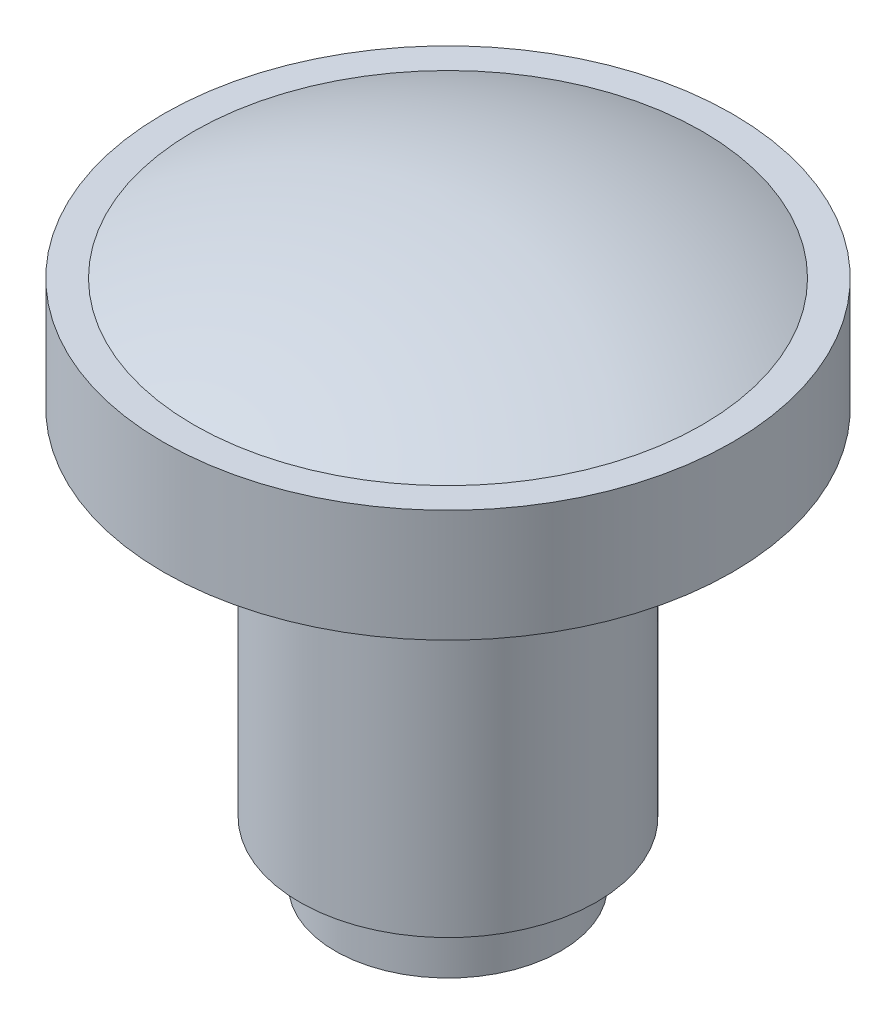
ISO-10303-21;
HEADER;
FILE_DESCRIPTION(('STEP AP214'),'2;1');
FILE_NAME('part.step','',(''),(''),'','','');
FILE_SCHEMA(('AUTOMOTIVE_DESIGN { 1 0 10303 214 1 1 1 1 }'));
ENDSEC;
DATA;
#1=APPLICATION_CONTEXT('core data for automotive mechanical design processes');
#2=APPLICATION_PROTOCOL_DEFINITION('international standard','automotive_design',2000,#1);
#3=PRODUCT_CONTEXT('',#1,'mechanical');
#4=PRODUCT('Part','Part','',(#3));
#5=PRODUCT_RELATED_PRODUCT_CATEGORY('part','',(#4));
#6=PRODUCT_DEFINITION_FORMATION('','',#4);
#7=PRODUCT_DEFINITION_CONTEXT('part definition',#1,'design');
#8=PRODUCT_DEFINITION('design','',#6,#7);
#9=PRODUCT_DEFINITION_SHAPE('','',#8);
#10=(LENGTH_UNIT() NAMED_UNIT(*) SI_UNIT(.MILLI.,.METRE.));
#11=(NAMED_UNIT(*) PLANE_ANGLE_UNIT() SI_UNIT($,.RADIAN.));
#12=(NAMED_UNIT(*) SI_UNIT($,.STERADIAN.) SOLID_ANGLE_UNIT());
#13=UNCERTAINTY_MEASURE_WITH_UNIT(LENGTH_MEASURE(1.E-05),#10,'distance_accuracy_value','');
#14=(GEOMETRIC_REPRESENTATION_CONTEXT(3) GLOBAL_UNCERTAINTY_ASSIGNED_CONTEXT((#13)) GLOBAL_UNIT_ASSIGNED_CONTEXT((#10,
#11,#12)) REPRESENTATION_CONTEXT('',''));
#15=CARTESIAN_POINT('',(0.,0.,0.));
#16=DIRECTION('',(0.,0.,1.));
#17=DIRECTION('',(1.,0.,0.));
#18=AXIS2_PLACEMENT_3D('',#15,#16,#17);
#19=CARTESIAN_POINT('',(11.2036290452944,0.,0.));
#20=DIRECTION('',(0.,-1.,0.));
#21=DIRECTION('',(1.,0.,0.));
#22=AXIS2_PLACEMENT_3D('',#19,#20,#21);
#23=PLANE('',#22);
#24=CARTESIAN_POINT('',(0.,0.,0.));
#25=DIRECTION('',(0.,-1.,0.));
#26=DIRECTION('',(1.,0.,0.));
#27=AXIS2_PLACEMENT_3D('',#24,#25,#26);
#28=CIRCLE('',#27,14.75);
#29=CARTESIAN_POINT('',(14.75,0.,0.));
#30=VERTEX_POINT('',#29);
#31=EDGE_CURVE('E10',#30,#30,#28,.T.);
#32=ORIENTED_EDGE('',*,*,#31,.T.);
#33=EDGE_LOOP('',(#32));
#34=FACE_BOUND('',#33,.T.);
#35=CARTESIAN_POINT('',(0.,0.,0.));
#36=DIRECTION('',(0.,-1.,0.));
#37=DIRECTION('',(1.,0.,0.));
#38=AXIS2_PLACEMENT_3D('',#35,#36,#37);
#39=CIRCLE('',#38,11.2036290452943);
#40=CARTESIAN_POINT('',(11.2036290452944,0.,0.));
#41=VERTEX_POINT('',#40);
#42=EDGE_CURVE('E57',#41,#41,#39,.T.);
#43=ORIENTED_EDGE('',*,*,#42,.F.);
#44=EDGE_LOOP('',(#43));
#45=FACE_BOUND('',#44,.T.);
#46=ADVANCED_FACE('F32',(#34,#45),#23,.T.);
#47=CARTESIAN_POINT('',(0.,46.3,0.));
#48=DIRECTION('',(0.,-1.,0.));
#49=DIRECTION('',(1.,0.,0.));
#50=AXIS2_PLACEMENT_3D('',#47,#48,#49);
#51=CYLINDRICAL_SURFACE('',#50,14.75);
#52=CARTESIAN_POINT('',(0.,30.,0.));
#53=DIRECTION('',(0.,-1.,0.));
#54=DIRECTION('',(1.,0.,0.));
#55=AXIS2_PLACEMENT_3D('',#52,#53,#54);
#56=CIRCLE('',#55,14.75);
#57=CARTESIAN_POINT('',(14.75,30.,0.));
#58=VERTEX_POINT('',#57);
#59=EDGE_CURVE('E38',#58,#58,#56,.T.);
#60=ORIENTED_EDGE('',*,*,#59,.T.);
#61=EDGE_LOOP('',(#60));
#62=FACE_BOUND('',#61,.T.);
#63=ORIENTED_EDGE('',*,*,#31,.F.);
#64=EDGE_LOOP('',(#63));
#65=FACE_BOUND('',#64,.T.);
#66=ADVANCED_FACE('F65',(#62,#65),#51,.T.);
#67=CARTESIAN_POINT('',(0.,30.,0.));
#68=DIRECTION('',(0.,1.,0.));
#69=DIRECTION('',(-1.,0.,0.));
#70=AXIS2_PLACEMENT_3D('',#67,#68,#69);
#71=CONICAL_SURFACE('',#70,14.75,1.20771848040224);
#72=CARTESIAN_POINT('',(0.,35.1289314926772,0.));
#73=DIRECTION('',(0.,-1.,0.));
#74=DIRECTION('',(1.,0.,0.));
#75=AXIS2_PLACEMENT_3D('',#72,#73,#74);
#76=CIRCLE('',#75,28.25);
#77=CARTESIAN_POINT('',(28.25,35.1289314926772,0.));
#78=VERTEX_POINT('',#77);
#79=EDGE_CURVE('E42',#78,#78,#76,.T.);
#80=ORIENTED_EDGE('',*,*,#79,.T.);
#81=EDGE_LOOP('',(#80));
#82=FACE_BOUND('',#81,.T.);
#83=ORIENTED_EDGE('',*,*,#59,.F.);
#84=EDGE_LOOP('',(#83));
#85=FACE_BOUND('',#84,.T.);
#86=ADVANCED_FACE('F69',(#82,#85),#71,.T.);
#87=CARTESIAN_POINT('',(0.,46.3,0.));
#88=DIRECTION('',(0.,-1.,0.));
#89=DIRECTION('',(1.,0.,0.));
#90=AXIS2_PLACEMENT_3D('',#87,#88,#89);
#91=CYLINDRICAL_SURFACE('',#90,28.25);
#92=CARTESIAN_POINT('',(0.,46.3,0.));
#93=DIRECTION('',(0.,-1.,0.));
#94=DIRECTION('',(1.,0.,0.));
#95=AXIS2_PLACEMENT_3D('',#92,#93,#94);
#96=CIRCLE('',#95,28.25);
#97=CARTESIAN_POINT('',(28.25,46.3,0.));
#98=VERTEX_POINT('',#97);
#99=EDGE_CURVE('E46',#98,#98,#96,.T.);
#100=ORIENTED_EDGE('',*,*,#99,.T.);
#101=EDGE_LOOP('',(#100));
#102=FACE_BOUND('',#101,.T.);
#103=ORIENTED_EDGE('',*,*,#79,.F.);
#104=EDGE_LOOP('',(#103));
#105=FACE_BOUND('',#104,.T.);
#106=ADVANCED_FACE('F73',(#102,#105),#91,.T.);
#107=CARTESIAN_POINT('',(25.25,46.3,0.));
#108=DIRECTION('',(0.,1.,0.));
#109=DIRECTION('',(-1.,0.,0.));
#110=AXIS2_PLACEMENT_3D('',#107,#108,#109);
#111=PLANE('',#110);
#112=CARTESIAN_POINT('',(0.,46.3,0.));
#113=DIRECTION('',(0.,-1.,0.));
#114=DIRECTION('',(1.,0.,0.));
#115=AXIS2_PLACEMENT_3D('',#112,#113,#114);
#116=CIRCLE('',#115,25.25);
#117=CARTESIAN_POINT('',(25.25,46.3,0.));
#118=VERTEX_POINT('',#117);
#119=EDGE_CURVE('E51',#118,#118,#116,.T.);
#120=ORIENTED_EDGE('',*,*,#119,.T.);
#121=EDGE_LOOP('',(#120));
#122=FACE_BOUND('',#121,.T.);
#123=ORIENTED_EDGE('',*,*,#99,.F.);
#124=EDGE_LOOP('',(#123));
#125=FACE_BOUND('',#124,.T.);
#126=ADVANCED_FACE('F80',(#122,#125),#111,.T.);
#127=CARTESIAN_POINT('',(0.,-5.76228448275857,0.));
#128=DIRECTION('',(0.,-1.,0.));
#129=DIRECTION('',(1.,0.,0.));
#130=AXIS2_PLACEMENT_3D('',#127,#128,#129);
#131=SPHERICAL_SURFACE('',#130,57.8622844827586);
#132=ORIENTED_EDGE('',*,*,#119,.F.);
#133=EDGE_LOOP('',(#132));
#134=FACE_BOUND('',#133,.T.);
#135=ADVANCED_FACE('F84',(#134),#131,.T.);
#136=CARTESIAN_POINT('',(0.,-5.98683286993631,0.));
#137=DIRECTION('',(0.,-1.,0.));
#138=DIRECTION('',(1.,0.,0.));
#139=AXIS2_PLACEMENT_3D('',#136,#137,#138);
#140=PLANE('',#139);
#141=CARTESIAN_POINT('',(0.,-5.98683286993631,0.));
#142=DIRECTION('',(0.,-1.,0.));
#143=DIRECTION('',(1.,0.,0.));
#144=AXIS2_PLACEMENT_3D('',#141,#142,#143);
#145=CIRCLE('',#144,11.2036290452943);
#146=CARTESIAN_POINT('',(11.2036290452944,-5.98683286993631,0.));
#147=VERTEX_POINT('',#146);
#148=EDGE_CURVE('E54',#147,#147,#145,.T.);
#149=ORIENTED_EDGE('',*,*,#148,.T.);
#150=EDGE_LOOP('',(#149));
#151=FACE_BOUND('',#150,.T.);
#152=ADVANCED_FACE('F88',(#151),#140,.T.);
#153=CARTESIAN_POINT('',(0.,46.3,0.));
#154=DIRECTION('',(0.,-1.,0.));
#155=DIRECTION('',(1.,0.,0.));
#156=AXIS2_PLACEMENT_3D('',#153,#154,#155);
#157=CYLINDRICAL_SURFACE('',#156,11.2036290452943);
#158=ORIENTED_EDGE('',*,*,#42,.T.);
#159=EDGE_LOOP('',(#158));
#160=FACE_BOUND('',#159,.T.);
#161=ORIENTED_EDGE('',*,*,#148,.F.);
#162=EDGE_LOOP('',(#161));
#163=FACE_BOUND('',#162,.T.);
#164=ADVANCED_FACE('F61',(#160,#163),#157,.T.);
#165=CLOSED_SHELL('',(#46,#66,#86,#106,#126,#135,#152,#164));
#166=MANIFOLD_SOLID_BREP('B2',#165);
#167=ADVANCED_BREP_SHAPE_REPRESENTATION('',(#18,#166),#14);
#168=SHAPE_DEFINITION_REPRESENTATION(#9,#167);
ENDSEC;
END-ISO-10303-21;
